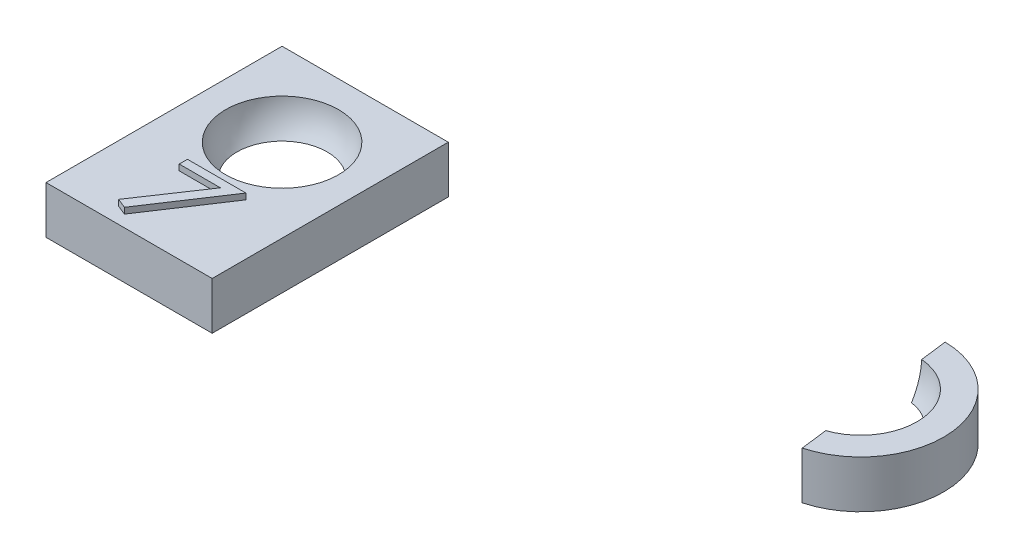
ISO-10303-21;
HEADER;
FILE_DESCRIPTION(('STEP AP214'),'2;1');
FILE_NAME('part.step','',(''),(''),'','','');
FILE_SCHEMA(('AUTOMOTIVE_DESIGN { 1 0 10303 214 1 1 1 1 }'));
ENDSEC;
DATA;
#1=APPLICATION_CONTEXT('core data for automotive mechanical design processes');
#2=APPLICATION_PROTOCOL_DEFINITION('international standard','automotive_design',2000,#1);
#3=PRODUCT_CONTEXT('',#1,'mechanical');
#4=PRODUCT('Part','Part','',(#3));
#5=PRODUCT_RELATED_PRODUCT_CATEGORY('part','',(#4));
#6=PRODUCT_DEFINITION_FORMATION('','',#4);
#7=PRODUCT_DEFINITION_CONTEXT('part definition',#1,'design');
#8=PRODUCT_DEFINITION('design','',#6,#7);
#9=PRODUCT_DEFINITION_SHAPE('','',#8);
#10=(LENGTH_UNIT() NAMED_UNIT(*) SI_UNIT(.MILLI.,.METRE.));
#11=(NAMED_UNIT(*) PLANE_ANGLE_UNIT() SI_UNIT($,.RADIAN.));
#12=(NAMED_UNIT(*) SI_UNIT($,.STERADIAN.) SOLID_ANGLE_UNIT());
#13=UNCERTAINTY_MEASURE_WITH_UNIT(LENGTH_MEASURE(1.E-05),#10,'distance_accuracy_value','');
#14=(GEOMETRIC_REPRESENTATION_CONTEXT(3) GLOBAL_UNCERTAINTY_ASSIGNED_CONTEXT((#13)) GLOBAL_UNIT_ASSIGNED_CONTEXT((#10,
#11,#12)) REPRESENTATION_CONTEXT('',''));
#15=CARTESIAN_POINT('',(0.,0.,0.));
#16=DIRECTION('',(0.,0.,1.));
#17=DIRECTION('',(1.,0.,0.));
#18=AXIS2_PLACEMENT_3D('',#15,#16,#17);
#19=CARTESIAN_POINT('',(0.,-15.5700000000001,1.90819582357449E-13));
#20=DIRECTION('',(0.,1.,0.));
#21=DIRECTION('',(-1.,0.,0.));
#22=AXIS2_PLACEMENT_3D('',#19,#20,#21);
#23=PLANE('',#22);
#24=CARTESIAN_POINT('',(-18.0191847198285,-15.5700000000003,-18.0208152801712));
#25=DIRECTION('',(0.,1.,0.));
#26=DIRECTION('',(0.,0.,1.));
#27=AXIS2_PLACEMENT_3D('',#24,#25,#26);
#28=CIRCLE('',#27,4.75526024524421);
#29=CARTESIAN_POINT('',(-18.0191847198285,-15.5700000000003,-22.7760755254154));
#30=VERTEX_POINT('',#29);
#31=EDGE_CURVE('E150',#30,#30,#28,.T.);
#32=ORIENTED_EDGE('',*,*,#31,.F.);
#33=EDGE_LOOP('',(#32));
#34=FACE_BOUND('',#33,.T.);
#35=DIRECTION('',(-0.928008798646951,0.,-0.372558276829067));
#36=VECTOR('',#35,1.);
#37=CARTESIAN_POINT('',(-19.4090428366668,-15.5700000000002,-6.13292969030034));
#38=LINE('',#37,#36);
#39=CARTESIAN_POINT('',(-19.4090428366668,-15.5700000000002,-6.13292969030034));
#40=VERTEX_POINT('',#39);
#41=CARTESIAN_POINT('',(-20.2323601443591,-15.5700000000002,-6.46345853645418));
#42=VERTEX_POINT('',#41);
#43=EDGE_CURVE('E194',#40,#42,#38,.T.);
#44=ORIENTED_EDGE('',*,*,#43,.T.);
#45=DIRECTION('',(0.557658175998312,0.,-0.830070695026776));
#46=VECTOR('',#45,1.);
#47=CARTESIAN_POINT('',(-20.2323601443591,-15.5700000000002,-6.46345853645418));
#48=LINE('',#47,#46);
#49=CARTESIAN_POINT('',(-16.7852447597437,-15.5700000000002,-11.5944681518388));
#50=VERTEX_POINT('',#49);
#51=EDGE_CURVE('E197',#42,#50,#48,.T.);
#52=ORIENTED_EDGE('',*,*,#51,.T.);
#53=DIRECTION('',(-1.,0.,0.));
#54=VECTOR('',#53,1.);
#55=CARTESIAN_POINT('',(-16.7852447597437,-15.5700000000002,-11.5944681518388));
#56=LINE('',#55,#54);
#57=CARTESIAN_POINT('',(-20.2563986058976,-15.5700000000002,-11.5944681518388));
#58=VERTEX_POINT('',#57);
#59=EDGE_CURVE('E172',#50,#58,#56,.T.);
#60=ORIENTED_EDGE('',*,*,#59,.T.);
#61=DIRECTION('',(0.,0.,-1.));
#62=VECTOR('',#61,1.);
#63=CARTESIAN_POINT('',(-20.2563986058976,-15.5700000000002,-11.5944681518388));
#64=LINE('',#63,#62);
#65=CARTESIAN_POINT('',(-20.2563986058976,-15.5700000000002,-12.2867758441465));
#66=VERTEX_POINT('',#65);
#67=EDGE_CURVE('E80',#58,#66,#64,.T.);
#68=ORIENTED_EDGE('',*,*,#67,.T.);
#69=DIRECTION('',(1.,0.,0.));
#70=VECTOR('',#69,1.);
#71=CARTESIAN_POINT('',(-20.2563986058976,-15.5700000000002,-12.2867758441465));
#72=LINE('',#71,#70);
#73=CARTESIAN_POINT('',(-15.3333216828206,-15.5700000000002,-12.2867758441465));
#74=VERTEX_POINT('',#73);
#75=EDGE_CURVE('E189',#66,#74,#72,.T.);
#76=ORIENTED_EDGE('',*,*,#75,.T.);
#77=DIRECTION('',(-0.552179947683433,0.,0.833724957870592));
#78=VECTOR('',#77,1.);
#79=CARTESIAN_POINT('',(-15.3333216828206,-15.5700000000002,-12.2867758441465));
#80=LINE('',#79,#78);
#81=EDGE_CURVE('E192',#74,#40,#80,.T.);
#82=ORIENTED_EDGE('',*,*,#81,.T.);
#83=EDGE_LOOP('',(#44,#52,#60,#68,#76,#82));
#84=FACE_BOUND('',#83,.T.);
#85=DIRECTION('',(1.,0.,0.));
#86=VECTOR('',#85,1.);
#87=CARTESIAN_POINT('',(0.,-15.5700000000001,-5.13292969030034));
#88=LINE('',#87,#86);
#89=CARTESIAN_POINT('',(-25.0191847198285,-15.5700000000002,-5.13292969030033));
#90=VERTEX_POINT('',#89);
#91=CARTESIAN_POINT('',(-11.0191847198285,-15.5700000000002,-5.13292969030034));
#92=VERTEX_POINT('',#91);
#93=EDGE_CURVE('E72',#90,#92,#88,.T.);
#94=ORIENTED_EDGE('',*,*,#93,.T.);
#95=DIRECTION('',(0.,0.,-1.));
#96=VECTOR('',#95,1.);
#97=CARTESIAN_POINT('',(-11.0191847198285,-15.5700000000002,1.91780732215901E-13));
#98=LINE('',#97,#96);
#99=CARTESIAN_POINT('',(-11.0191847198285,-15.5700000000002,-25.0208152801712));
#100=VERTEX_POINT('',#99);
#101=EDGE_CURVE('E163',#92,#100,#98,.T.);
#102=ORIENTED_EDGE('',*,*,#101,.T.);
#103=DIRECTION('',(-1.,0.,0.));
#104=VECTOR('',#103,1.);
#105=CARTESIAN_POINT('',(-5.99999999999993,-15.5700000000002,-25.0208152801712));
#106=LINE('',#105,#104);
#107=CARTESIAN_POINT('',(-25.0191847198285,-15.5700000000003,-25.0208152801712));
#108=VERTEX_POINT('',#107);
#109=EDGE_CURVE('E165',#100,#108,#106,.T.);
#110=ORIENTED_EDGE('',*,*,#109,.T.);
#111=DIRECTION('',(0.,0.,1.));
#112=VECTOR('',#111,1.);
#113=CARTESIAN_POINT('',(-25.0191847198285,-15.5700000000002,0.));
#114=LINE('',#113,#112);
#115=EDGE_CURVE('E159',#108,#90,#114,.T.);
#116=ORIENTED_EDGE('',*,*,#115,.T.);
#117=EDGE_LOOP('',(#94,#102,#110,#116));
#118=FACE_BOUND('',#117,.T.);
#119=ADVANCED_FACE('F56',(#34,#84,#118),#23,.T.);
#120=CARTESIAN_POINT('',(0.,-19.5700000000001,2.04697370165263E-13));
#121=DIRECTION('',(0.,1.,0.));
#122=DIRECTION('',(-1.,0.,0.));
#123=AXIS2_PLACEMENT_3D('',#120,#121,#122);
#124=PLANE('',#123);
#125=CARTESIAN_POINT('',(-18.0191847198285,-19.5700000000003,-18.0208152801712));
#126=DIRECTION('',(0.,1.,0.));
#127=DIRECTION('',(0.,0.,1.));
#128=AXIS2_PLACEMENT_3D('',#125,#126,#127);
#129=CIRCLE('',#128,6.20608891324561);
#130=CARTESIAN_POINT('',(-18.0191847198285,-19.5700000000002,-11.8147263669256));
#131=VERTEX_POINT('',#130);
#132=EDGE_CURVE('E65',#131,#131,#129,.T.);
#133=ORIENTED_EDGE('',*,*,#132,.T.);
#134=EDGE_LOOP('',(#133));
#135=FACE_BOUND('',#134,.T.);
#136=DIRECTION('',(0.,0.,-1.));
#137=VECTOR('',#136,1.);
#138=CARTESIAN_POINT('',(-11.0191847198285,-19.5700000000009,-25.0208152801712));
#139=LINE('',#138,#137);
#140=CARTESIAN_POINT('',(-11.0191847198285,-19.5700000000008,-5.13292969030032));
#141=VERTEX_POINT('',#140);
#142=CARTESIAN_POINT('',(-11.0191847198285,-19.5700000000009,-25.0208152801712));
#143=VERTEX_POINT('',#142);
#144=EDGE_CURVE('E143',#141,#143,#139,.T.);
#145=ORIENTED_EDGE('',*,*,#144,.F.);
#146=DIRECTION('',(1.,0.,0.));
#147=VECTOR('',#146,1.);
#148=CARTESIAN_POINT('',(-25.0191847198285,-19.5700000000009,-5.13292969030032));
#149=LINE('',#148,#147);
#150=CARTESIAN_POINT('',(-25.0191847198285,-19.5700000000009,-5.13292969030032));
#151=VERTEX_POINT('',#150);
#152=EDGE_CURVE('E136',#151,#141,#149,.T.);
#153=ORIENTED_EDGE('',*,*,#152,.F.);
#154=DIRECTION('',(0.,0.,-1.));
#155=VECTOR('',#154,1.);
#156=CARTESIAN_POINT('',(-25.0191847198285,-19.5700000000002,0.));
#157=LINE('',#156,#155);
#158=CARTESIAN_POINT('',(-25.0191847198285,-19.5700000000003,-25.0208152801712));
#159=VERTEX_POINT('',#158);
#160=EDGE_CURVE('E148',#151,#159,#157,.T.);
#161=ORIENTED_EDGE('',*,*,#160,.T.);
#162=DIRECTION('',(1.,0.,0.));
#163=VECTOR('',#162,1.);
#164=CARTESIAN_POINT('',(-5.99999999999992,-19.5700000000002,-25.0208152801712));
#165=LINE('',#164,#163);
#166=EDGE_CURVE('E156',#159,#143,#165,.T.);
#167=ORIENTED_EDGE('',*,*,#166,.T.);
#168=EDGE_LOOP('',(#145,#153,#161,#167));
#169=FACE_BOUND('',#168,.T.);
#170=ADVANCED_FACE('F146',(#135,#169),#124,.F.);
#171=CARTESIAN_POINT('',(-5.99999999999981,-50.9988177425023,-25.0208152801711));
#172=DIRECTION('',(0.,0.,-1.));
#173=DIRECTION('',(0.,1.,0.));
#174=AXIS2_PLACEMENT_3D('',#171,#172,#173);
#175=PLANE('',#174);
#176=ORIENTED_EDGE('',*,*,#109,.F.);
#177=DIRECTION('',(0.,1.,0.));
#178=VECTOR('',#177,1.);
#179=CARTESIAN_POINT('',(-11.0191847198285,-19.5700000000009,-25.0208152801712));
#180=LINE('',#179,#178);
#181=EDGE_CURVE('E278',#143,#100,#180,.T.);
#182=ORIENTED_EDGE('',*,*,#181,.F.);
#183=ORIENTED_EDGE('',*,*,#166,.F.);
#184=DIRECTION('',(0.,1.,0.));
#185=VECTOR('',#184,1.);
#186=CARTESIAN_POINT('',(-25.0191847198284,-50.9988177425024,-25.0208152801711));
#187=LINE('',#186,#185);
#188=EDGE_CURVE('E155',#159,#108,#187,.T.);
#189=ORIENTED_EDGE('',*,*,#188,.T.);
#190=EDGE_LOOP('',(#176,#182,#183,#189));
#191=FACE_BOUND('',#190,.T.);
#192=ADVANCED_FACE('F233',(#191),#175,.T.);
#193=CARTESIAN_POINT('',(-25.0191847198284,-50.9988177425023,1.80390598819962E-13));
#194=DIRECTION('',(-1.,0.,0.));
#195=DIRECTION('',(0.,-1.,0.));
#196=AXIS2_PLACEMENT_3D('',#193,#194,#195);
#197=PLANE('',#196);
#198=ORIENTED_EDGE('',*,*,#160,.F.);
#199=DIRECTION('',(0.,1.,0.));
#200=VECTOR('',#199,1.);
#201=CARTESIAN_POINT('',(-25.0191847198285,-19.5700000000009,-5.13292969030032));
#202=LINE('',#201,#200);
#203=EDGE_CURVE('E133',#151,#90,#202,.T.);
#204=ORIENTED_EDGE('',*,*,#203,.T.);
#205=ORIENTED_EDGE('',*,*,#115,.F.);
#206=ORIENTED_EDGE('',*,*,#188,.F.);
#207=EDGE_LOOP('',(#198,#204,#205,#206));
#208=FACE_BOUND('',#207,.T.);
#209=ADVANCED_FACE('F153',(#208),#197,.T.);
#210=CARTESIAN_POINT('',(-20.2563986058976,-15.0700000000002,-11.5944681518388));
#211=DIRECTION('',(-1.,0.,0.));
#212=DIRECTION('',(0.,-1.,0.));
#213=AXIS2_PLACEMENT_3D('',#210,#211,#212);
#214=PLANE('',#213);
#215=ORIENTED_EDGE('',*,*,#67,.F.);
#216=DIRECTION('',(0.,-1.,0.));
#217=VECTOR('',#216,1.);
#218=CARTESIAN_POINT('',(-20.2563986058976,-15.0700000000002,-11.5944681518388));
#219=LINE('',#218,#217);
#220=CARTESIAN_POINT('',(-20.2563986058976,-15.0700000000002,-11.5944681518388));
#221=VERTEX_POINT('',#220);
#222=EDGE_CURVE('E200',#221,#58,#219,.T.);
#223=ORIENTED_EDGE('',*,*,#222,.F.);
#224=DIRECTION('',(0.,0.,-1.));
#225=VECTOR('',#224,1.);
#226=CARTESIAN_POINT('',(-20.2563986058976,-15.0700000000002,-11.5944681518388));
#227=LINE('',#226,#225);
#228=CARTESIAN_POINT('',(-20.2563986058976,-15.0700000000002,-12.2867758441465));
#229=VERTEX_POINT('',#228);
#230=EDGE_CURVE('E168',#221,#229,#227,.T.);
#231=ORIENTED_EDGE('',*,*,#230,.T.);
#232=DIRECTION('',(0.,-1.,0.));
#233=VECTOR('',#232,1.);
#234=CARTESIAN_POINT('',(-20.2563986058976,-15.0700000000002,-12.2867758441465));
#235=LINE('',#234,#233);
#236=EDGE_CURVE('E187',#229,#66,#235,.T.);
#237=ORIENTED_EDGE('',*,*,#236,.T.);
#238=EDGE_LOOP('',(#215,#223,#231,#237));
#239=FACE_BOUND('',#238,.T.);
#240=ADVANCED_FACE('F238',(#239),#214,.T.);
#241=CARTESIAN_POINT('',(-16.7852447597437,-15.0700000000002,-11.5944681518388));
#242=DIRECTION('',(0.,0.,1.));
#243=DIRECTION('',(0.,-1.,0.));
#244=AXIS2_PLACEMENT_3D('',#241,#242,#243);
#245=PLANE('',#244);
#246=ORIENTED_EDGE('',*,*,#59,.F.);
#247=DIRECTION('',(0.,-1.,0.));
#248=VECTOR('',#247,1.);
#249=CARTESIAN_POINT('',(-16.7852447597437,-15.0700000000002,-11.5944681518388));
#250=LINE('',#249,#248);
#251=CARTESIAN_POINT('',(-16.7852447597437,-15.0700000000002,-11.5944681518388));
#252=VERTEX_POINT('',#251);
#253=EDGE_CURVE('E204',#252,#50,#250,.T.);
#254=ORIENTED_EDGE('',*,*,#253,.F.);
#255=DIRECTION('',(-1.,0.,0.));
#256=VECTOR('',#255,1.);
#257=CARTESIAN_POINT('',(-16.7852447597437,-15.0700000000002,-11.5944681518388));
#258=LINE('',#257,#256);
#259=EDGE_CURVE('E184',#252,#221,#258,.T.);
#260=ORIENTED_EDGE('',*,*,#259,.T.);
#261=ORIENTED_EDGE('',*,*,#222,.T.);
#262=EDGE_LOOP('',(#246,#254,#260,#261));
#263=FACE_BOUND('',#262,.T.);
#264=ADVANCED_FACE('F241',(#263),#245,.T.);
#265=CARTESIAN_POINT('',(-20.2323601443591,-15.0700000000002,-6.46345853645418));
#266=DIRECTION('',(-0.830070695026776,0.,-0.557658175998312));
#267=DIRECTION('',(-0.557658175998312,0.,0.830070695026776));
#268=AXIS2_PLACEMENT_3D('',#265,#266,#267);
#269=PLANE('',#268);
#270=ORIENTED_EDGE('',*,*,#51,.F.);
#271=DIRECTION('',(0.,-1.,0.));
#272=VECTOR('',#271,1.);
#273=CARTESIAN_POINT('',(-20.2323601443591,-15.0700000000002,-6.46345853645418));
#274=LINE('',#273,#272);
#275=CARTESIAN_POINT('',(-20.2323601443591,-15.0700000000002,-6.46345853645418));
#276=VERTEX_POINT('',#275);
#277=EDGE_CURVE('E206',#276,#42,#274,.T.);
#278=ORIENTED_EDGE('',*,*,#277,.F.);
#279=DIRECTION('',(0.557658175998312,0.,-0.830070695026776));
#280=VECTOR('',#279,1.);
#281=CARTESIAN_POINT('',(-20.2323601443591,-15.0700000000002,-6.46345853645418));
#282=LINE('',#281,#280);
#283=EDGE_CURVE('E181',#276,#252,#282,.T.);
#284=ORIENTED_EDGE('',*,*,#283,.T.);
#285=ORIENTED_EDGE('',*,*,#253,.T.);
#286=EDGE_LOOP('',(#270,#278,#284,#285));
#287=FACE_BOUND('',#286,.T.);
#288=ADVANCED_FACE('F254',(#287),#269,.T.);
#289=CARTESIAN_POINT('',(-19.4090428366668,-15.0700000000002,-6.13292969030034));
#290=DIRECTION('',(-0.372558276829067,0.,0.928008798646951));
#291=DIRECTION('',(0.928008798646951,0.,0.372558276829067));
#292=AXIS2_PLACEMENT_3D('',#289,#290,#291);
#293=PLANE('',#292);
#294=ORIENTED_EDGE('',*,*,#43,.F.);
#295=DIRECTION('',(0.,-1.,0.));
#296=VECTOR('',#295,1.);
#297=CARTESIAN_POINT('',(-19.4090428366668,-15.0700000000002,-6.13292969030034));
#298=LINE('',#297,#296);
#299=CARTESIAN_POINT('',(-19.4090428366668,-15.0700000000002,-6.13292969030034));
#300=VERTEX_POINT('',#299);
#301=EDGE_CURVE('E209',#300,#40,#298,.T.);
#302=ORIENTED_EDGE('',*,*,#301,.F.);
#303=DIRECTION('',(-0.928008798646951,0.,-0.372558276829067));
#304=VECTOR('',#303,1.);
#305=CARTESIAN_POINT('',(-19.4090428366668,-15.0700000000002,-6.13292969030034));
#306=LINE('',#305,#304);
#307=EDGE_CURVE('E178',#300,#276,#306,.T.);
#308=ORIENTED_EDGE('',*,*,#307,.T.);
#309=ORIENTED_EDGE('',*,*,#277,.T.);
#310=EDGE_LOOP('',(#294,#302,#308,#309));
#311=FACE_BOUND('',#310,.T.);
#312=ADVANCED_FACE('F250',(#311),#293,.T.);
#313=CARTESIAN_POINT('',(-15.3333216828206,-15.0700000000002,-12.2867758441465));
#314=DIRECTION('',(0.833724957870592,0.,0.552179947683434));
#315=DIRECTION('',(0.552179947683433,0.,-0.833724957870592));
#316=AXIS2_PLACEMENT_3D('',#313,#314,#315);
#317=PLANE('',#316);
#318=ORIENTED_EDGE('',*,*,#81,.F.);
#319=DIRECTION('',(0.,-1.,0.));
#320=VECTOR('',#319,1.);
#321=CARTESIAN_POINT('',(-15.3333216828206,-15.0700000000002,-12.2867758441465));
#322=LINE('',#321,#320);
#323=CARTESIAN_POINT('',(-15.3333216828206,-15.0700000000002,-12.2867758441465));
#324=VERTEX_POINT('',#323);
#325=EDGE_CURVE('E212',#324,#74,#322,.T.);
#326=ORIENTED_EDGE('',*,*,#325,.F.);
#327=DIRECTION('',(-0.552179947683433,0.,0.833724957870592));
#328=VECTOR('',#327,1.);
#329=CARTESIAN_POINT('',(-15.3333216828206,-15.0700000000002,-12.2867758441465));
#330=LINE('',#329,#328);
#331=EDGE_CURVE('E175',#324,#300,#330,.T.);
#332=ORIENTED_EDGE('',*,*,#331,.T.);
#333=ORIENTED_EDGE('',*,*,#301,.T.);
#334=EDGE_LOOP('',(#318,#326,#332,#333));
#335=FACE_BOUND('',#334,.T.);
#336=ADVANCED_FACE('F246',(#335),#317,.T.);
#337=CARTESIAN_POINT('',(-20.2563986058976,-15.0700000000002,-12.2867758441465));
#338=DIRECTION('',(0.,0.,-1.));
#339=DIRECTION('',(0.,1.,0.));
#340=AXIS2_PLACEMENT_3D('',#337,#338,#339);
#341=PLANE('',#340);
#342=ORIENTED_EDGE('',*,*,#75,.F.);
#343=ORIENTED_EDGE('',*,*,#236,.F.);
#344=DIRECTION('',(1.,0.,0.));
#345=VECTOR('',#344,1.);
#346=CARTESIAN_POINT('',(-20.2563986058976,-15.0700000000002,-12.2867758441465));
#347=LINE('',#346,#345);
#348=EDGE_CURVE('E171',#229,#324,#347,.T.);
#349=ORIENTED_EDGE('',*,*,#348,.T.);
#350=ORIENTED_EDGE('',*,*,#325,.T.);
#351=EDGE_LOOP('',(#342,#343,#349,#350));
#352=FACE_BOUND('',#351,.T.);
#353=ADVANCED_FACE('F242',(#352),#341,.T.);
#354=CARTESIAN_POINT('',(0.,-15.0700000000001,0.));
#355=DIRECTION('',(0.,-1.,0.));
#356=DIRECTION('',(1.,0.,0.));
#357=AXIS2_PLACEMENT_3D('',#354,#355,#356);
#358=PLANE('',#357);
#359=ORIENTED_EDGE('',*,*,#230,.F.);
#360=ORIENTED_EDGE('',*,*,#259,.F.);
#361=ORIENTED_EDGE('',*,*,#283,.F.);
#362=ORIENTED_EDGE('',*,*,#307,.F.);
#363=ORIENTED_EDGE('',*,*,#331,.F.);
#364=ORIENTED_EDGE('',*,*,#348,.F.);
#365=EDGE_LOOP('',(#359,#360,#361,#362,#363,#364));
#366=FACE_BOUND('',#365,.T.);
#367=ADVANCED_FACE('F245',(#366),#358,.F.);
#368=CARTESIAN_POINT('',(-11.0191847198285,-19.5700000000009,-25.0208152801712));
#369=DIRECTION('',(1.,0.,0.));
#370=DIRECTION('',(0.,1.,0.));
#371=AXIS2_PLACEMENT_3D('',#368,#369,#370);
#372=PLANE('',#371);
#373=DIRECTION('',(0.,1.,0.));
#374=VECTOR('',#373,1.);
#375=CARTESIAN_POINT('',(-11.0191847198285,-19.5700000000008,-5.13292969030032));
#376=LINE('',#375,#374);
#377=EDGE_CURVE('E142',#141,#92,#376,.T.);
#378=ORIENTED_EDGE('',*,*,#377,.F.);
#379=ORIENTED_EDGE('',*,*,#144,.T.);
#380=ORIENTED_EDGE('',*,*,#181,.T.);
#381=ORIENTED_EDGE('',*,*,#101,.F.);
#382=EDGE_LOOP('',(#378,#379,#380,#381));
#383=FACE_BOUND('',#382,.T.);
#384=ADVANCED_FACE('F264',(#383),#372,.T.);
#385=CARTESIAN_POINT('',(-25.0191847198285,-19.5700000000009,-5.13292969030032));
#386=DIRECTION('',(0.,0.,1.));
#387=DIRECTION('',(0.,-1.,0.));
#388=AXIS2_PLACEMENT_3D('',#385,#386,#387);
#389=PLANE('',#388);
#390=ORIENTED_EDGE('',*,*,#203,.F.);
#391=ORIENTED_EDGE('',*,*,#152,.T.);
#392=ORIENTED_EDGE('',*,*,#377,.T.);
#393=ORIENTED_EDGE('',*,*,#93,.F.);
#394=EDGE_LOOP('',(#390,#391,#392,#393));
#395=FACE_BOUND('',#394,.T.);
#396=ADVANCED_FACE('F135',(#395),#389,.T.);
#397=CARTESIAN_POINT('',(-18.0191847198285,-15.3075000000003,-18.0208152801712));
#398=DIRECTION('',(0.,1.,0.));
#399=DIRECTION('',(0.,0.,-1.));
#400=AXIS2_PLACEMENT_3D('',#397,#398,#399);
#401=SPHERICAL_SURFACE('',#400,4.7625);
#402=CARTESIAN_POINT('',(-18.0191847198285,-18.1800664868789,-18.0208152801712));
#403=DIRECTION('',(0.,-1.,0.));
#404=DIRECTION('',(0.,0.,-1.));
#405=AXIS2_PLACEMENT_3D('',#402,#403,#404);
#406=CIRCLE('',#405,3.79865344937671);
#407=CARTESIAN_POINT('',(-18.0191847198285,-18.1800664868789,-21.8194687295479));
#408=VERTEX_POINT('',#407);
#409=EDGE_CURVE('E13',#408,#408,#406,.T.);
#410=CARTESIAN_POINT('',(-18.0191847198285,-18.1800664868789,-21.8194687295479));
#411=CARTESIAN_POINT('',(-18.0191847198285,-18.1566289967111,-21.8371923542528));
#412=CARTESIAN_POINT('',(-18.0191847198285,-18.133027437142,-21.8546990134291));
#413=CARTESIAN_POINT('',(-18.0191847198285,-18.0855043516693,-21.8892725216941));
#414=CARTESIAN_POINT('',(-18.0191847198285,-18.0615828257659,-21.9063393707828));
#415=CARTESIAN_POINT('',(-18.0191847198285,-18.0134279800933,-21.9400273798422));
#416=CARTESIAN_POINT('',(-18.0191847198285,-17.9891946603241,-21.9566485398128));
#417=CARTESIAN_POINT('',(-18.0191847198285,-17.9404245355837,-21.9894394846757));
#418=CARTESIAN_POINT('',(-18.0191847198285,-17.9158877306125,-22.0056092695679));
#419=CARTESIAN_POINT('',(-18.0191847198285,-17.866519040237,-22.0374919221387));
#420=CARTESIAN_POINT('',(-18.0191847198285,-17.8416871548327,-22.0532047898172));
#421=CARTESIAN_POINT('',(-18.0191847198285,-17.7917368115647,-22.0841682252661));
#422=CARTESIAN_POINT('',(-18.0191847198285,-17.7666183537009,-22.0994187930364));
#423=CARTESIAN_POINT('',(-18.0191847198285,-17.7161034711039,-22.1294524035841));
#424=CARTESIAN_POINT('',(-18.0191847198285,-17.6907070463706,-22.1442354463614));
#425=CARTESIAN_POINT('',(-18.0191847198285,-17.6396449310085,-22.1733289422225));
#426=CARTESIAN_POINT('',(-18.0191847198285,-17.6139792403797,-22.1876393953064));
#427=CARTESIAN_POINT('',(-18.0191847198285,-17.5623873864119,-22.2157828089361));
#428=CARTESIAN_POINT('',(-18.0191847198285,-17.5364612230729,-22.2296157694819));
#429=CARTESIAN_POINT('',(-18.0191847198285,-17.4843573061204,-22.2567994587973));
#430=CARTESIAN_POINT('',(-18.0191847198285,-17.4581795525067,-22.2701501875669));
#431=CARTESIAN_POINT('',(-18.0191847198285,-17.4055814236334,-22.2963648393025));
#432=CARTESIAN_POINT('',(-18.0191847198285,-17.3791610483738,-22.3092287622685));
#433=CARTESIAN_POINT('',(-18.0191847198285,-17.3260867279613,-22.3344653951528));
#434=CARTESIAN_POINT('',(-18.0191847198285,-17.2994327828084,-22.3468381050712));
#435=CARTESIAN_POINT('',(-18.0191847198285,-17.2459004543843,-22.3710880729079));
#436=CARTESIAN_POINT('',(-18.0191847198285,-17.2190220711131,-22.3829653308263));
#437=CARTESIAN_POINT('',(-18.0191847198285,-17.1650500751207,-22.4062203254551));
#438=CARTESIAN_POINT('',(-18.0191847198285,-17.1379564623995,-22.4175980621656));
#439=CARTESIAN_POINT('',(-18.0191847198285,-17.0835632899145,-22.4398501163091));
#440=CARTESIAN_POINT('',(-18.0191847198285,-17.0562637301507,-22.4507244337422));
#441=CARTESIAN_POINT('',(-18.0191847198285,-17.0014680165459,-22.4719659237354));
#442=CARTESIAN_POINT('',(-18.0191847198285,-16.9739718627049,-22.4823330962956));
#443=CARTESIAN_POINT('',(-18.0191847198285,-16.9187923812658,-22.5025567446978));
#444=CARTESIAN_POINT('',(-18.0191847198285,-16.8911090536676,-22.5124132205399));
#445=CARTESIAN_POINT('',(-18.0191847198285,-16.8355647091603,-22.5316120986281));
#446=CARTESIAN_POINT('',(-18.0191847198285,-16.8077036922512,-22.5409545008743));
#447=CARTESIAN_POINT('',(-18.0191847198285,-16.7518135144459,-22.5591220310168));
#448=CARTESIAN_POINT('',(-18.0191847198285,-16.7237843535497,-22.5679471589133));
#449=CARTESIAN_POINT('',(-18.0191847198285,-16.6675674907007,-22.5850771168236));
#450=CARTESIAN_POINT('',(-18.0191847198285,-16.639379788748,-22.5933819468374));
#451=CARTESIAN_POINT('',(-18.0191847198285,-16.5828555010336,-22.6094684637062));
#452=CARTESIAN_POINT('',(-18.0191847198285,-16.5545189152719,-22.6172501505611));
#453=CARTESIAN_POINT('',(-18.0191847198285,-16.4977065681956,-22.6322877150673));
#454=CARTESIAN_POINT('',(-18.0191847198285,-16.4692308068811,-22.6395435927185));
#455=CARTESIAN_POINT('',(-18.0191847198285,-16.4121498646371,-22.6535270529171));
#456=CARTESIAN_POINT('',(-18.0191847198285,-16.3835446837077,-22.6602546354645));
#457=CARTESIAN_POINT('',(-18.0191847198285,-16.3262147025122,-22.6731792005529));
#458=CARTESIAN_POINT('',(-18.0191847198285,-16.2974899022461,-22.679376183094));
#459=CARTESIAN_POINT('',(-18.0191847198285,-16.2399305236371,-22.6912374250488));
#460=CARTESIAN_POINT('',(-18.0191847198285,-16.2110959452942,-22.6969016844625));
#461=CARTESIAN_POINT('',(-18.0191847198285,-16.1533268894034,-22.7076955395736));
#462=CARTESIAN_POINT('',(-18.0191847198285,-16.1243924118555,-22.7128251352708));
#463=CARTESIAN_POINT('',(-18.0191847198285,-16.0664334706472,-22.7225479054696));
#464=CARTESIAN_POINT('',(-18.0191847198285,-16.0374090069869,-22.7271410799711));
#465=CARTESIAN_POINT('',(-18.0191847198285,-15.9792800374952,-22.7357894343362));
#466=CARTESIAN_POINT('',(-18.0191847198285,-15.9501755316638,-22.7398446141998));
#467=CARTESIAN_POINT('',(-18.0191847198285,-15.8918964491233,-22.7474155892086));
#468=CARTESIAN_POINT('',(-18.0191847198285,-15.8627218724143,-22.7509313843539));
#469=CARTESIAN_POINT('',(-18.0191847198285,-15.8043126436825,-22.7574223882167));
#470=CARTESIAN_POINT('',(-18.0191847198285,-15.7750779916597,-22.7603975969343));
#471=CARTESIAN_POINT('',(-18.0191847198285,-15.7165586274619,-22.7658063980975));
#472=CARTESIAN_POINT('',(-18.0191847198285,-15.6872739152869,-22.7682399905432));
#473=CARTESIAN_POINT('',(-18.0191847198285,-15.6286644667712,-22.772564764673));
#474=CARTESIAN_POINT('',(-18.0191847198285,-15.5993397304305,-22.7744559463571));
#475=CARTESIAN_POINT('',(-18.0191847198285,-15.5700000000003,-22.7760755254154));
#476=B_SPLINE_CURVE_WITH_KNOTS('',3,(#410,#411,#412,#413,#414,#415,#416,#417,#418,#419,#420,
#421,#422,#423,#424,#425,#426,#427,#428,#429,#430,#431,#432,#433,#434,#435,#436,#437,#438,#439,
#440,#441,#442,#443,#444,#445,#446,#447,#448,#449,#450,#451,#452,#453,#454,#455,#456,#457,#458,
#459,#460,#461,#462,#463,#464,#465,#466,#467,#468,#469,#470,#471,#472,#473,#474,#475),
.UNSPECIFIED.,.F.,.F.,(4,2,2,2,2,2,2,2,2,2,2,2,2,2,2,2,2,2,2,2,2,2,2,2,2,2,2,2,2,2,2,2,4),(0.,
0.0881519323458192,0.176303864691639,0.264455797037459,0.352607729383277,0.440759661729097,
0.528911594074916,0.617063526420733,0.705215458766552,0.793367391112372,0.881519323458191,
0.969671255804008,1.05782318814983,1.14597512049565,1.23412705284146,1.32227898518729,
1.4104309175331,1.49858284987892,1.58673478222474,1.67488671457056,1.76303864691638,
1.8511905792622,1.93934251160801,2.02749444395383,2.11564637629965,2.20379830864547,
2.29195024099129,2.38010217333711,2.46825410568293,2.55640603802875,2.64455797037457,
2.73270990272039,2.8208618350662),.UNSPECIFIED.);
#477=EDGE_CURVE('BSEAM219',#408,#30,#476,.T.);
#478=ORIENTED_EDGE('',*,*,#409,.T.);
#479=ORIENTED_EDGE('',*,*,#31,.T.);
#480=ORIENTED_EDGE('',*,*,#477,.T.);
#481=ORIENTED_EDGE('',*,*,#477,.F.);
#482=EDGE_LOOP('',(#478,#480,#479,#481));
#483=FACE_BOUND('',#482,.T.);
#484=ADVANCED_FACE('F219',(#483),#401,.F.);
#485=CARTESIAN_POINT('',(-18.0191847198285,-19.5700000000003,-18.0208152801712));
#486=DIRECTION('',(0.,-1.,0.));
#487=DIRECTION('',(0.,0.,-1.));
#488=AXIS2_PLACEMENT_3D('',#485,#486,#487);
#489=CONICAL_SURFACE('',#488,6.2060889132456,1.0471975511966);
#490=ORIENTED_EDGE('',*,*,#409,.F.);
#491=EDGE_LOOP('',(#490));
#492=FACE_BOUND('',#491,.T.);
#493=ORIENTED_EDGE('',*,*,#132,.F.);
#494=EDGE_LOOP('',(#493));
#495=FACE_BOUND('',#494,.T.);
#496=ADVANCED_FACE('F59',(#492,#495),#489,.F.);
#497=CLOSED_SHELL('',(#119,#170,#192,#209,#240,#264,#288,#312,#336,#353,#367,#384,#396,#484,#496));
#498=MANIFOLD_SOLID_BREP('B2',#497);
#499=CARTESIAN_POINT('',(24.37,-17.8200000000001,-24.3700188957371));
#500=DIRECTION('',(0.,-1.,0.));
#501=DIRECTION('',(0.,0.,-1.));
#502=AXIS2_PLACEMENT_3D('',#499,#500,#501);
#503=CONICAL_SURFACE('',#502,3.175,1.0471975511966);
#504=CARTESIAN_POINT('',(24.591680020619,-19.5707000000001,-30.5733605761064));
#505=CARTESIAN_POINT('',(24.62411249878,-19.4210633417584,-30.3127991752362));
#506=CARTESIAN_POINT('',(24.6565546461707,-19.2715623315264,-30.0521600921117));
#507=CARTESIAN_POINT('',(24.7214806848743,-18.9731102118698,-29.5305465566429));
#508=CARTESIAN_POINT('',(24.7539645791144,-18.8241591441993,-29.2695720807828));
#509=CARTESIAN_POINT('',(24.8189155716024,-18.5274556161001,-28.7477580674793));
#510=CARTESIAN_POINT('',(24.851382531109,-18.3797011658782,-28.4869196446785));
#511=CARTESIAN_POINT('',(24.9164144555035,-18.0856384492201,-27.9644554272542));
#512=CARTESIAN_POINT('',(24.9489794152463,-17.939330108532,-27.7028296739665));
#513=CARTESIAN_POINT('',(24.9980992049961,-17.7214369217852,-27.3082029925237));
#514=CARTESIAN_POINT('',(25.0145820145963,-17.648790085795,-27.1757806738103));
#515=CARTESIAN_POINT('',(25.0476227209946,-17.5045928247885,-26.9103327884485));
#516=CARTESIAN_POINT('',(25.0641806246636,-17.4330425028355,-26.7773071665991));
#517=CARTESIAN_POINT('',(25.0974455822974,-17.291492527359,-26.5100576546161));
#518=CARTESIAN_POINT('',(25.1141528875013,-17.2214967119262,-26.3758317460353));
#519=CARTESIAN_POINT('',(25.1393506613054,-17.1187226808035,-26.1733937081948));
#520=CARTESIAN_POINT('',(25.147772075631,-17.0848371141367,-26.1057363585746));
#521=CARTESIAN_POINT('',(25.1646756154505,-17.018075785263,-25.9699339079214));
#522=CARTESIAN_POINT('',(25.1731577387882,-16.9851999874104,-25.9017888242107));
#523=CARTESIAN_POINT('',(25.1905173802386,-16.9196464220005,-25.7623220689271));
#524=CARTESIAN_POINT('',(25.1993979249038,-16.8870208868123,-25.690976082137));
#525=CARTESIAN_POINT('',(25.2172742055994,-16.8239210113208,-25.5473586651364));
#526=CARTESIAN_POINT('',(25.2262699206461,-16.793446285552,-25.4750874035095));
#527=CARTESIAN_POINT('',(25.2444016068811,-16.735719848287,-25.3294180672939));
#528=CARTESIAN_POINT('',(25.2535373055015,-16.7084625976426,-25.2560221825067));
#529=CARTESIAN_POINT('',(25.2720072227694,-16.6587177585985,-25.1076355099439));
#530=CARTESIAN_POINT('',(25.2813413505776,-16.6362280372818,-25.0326454519683));
#531=CARTESIAN_POINT('',(25.2974313932516,-16.6039626059642,-24.9033786090714));
#532=CARTESIAN_POINT('',(25.3041315006663,-16.5923942430296,-24.8495501792705));
#533=CARTESIAN_POINT('',(25.3176260003785,-16.5737141891517,-24.7411358382014));
#534=CARTESIAN_POINT('',(25.3244203521638,-16.566600640437,-24.6865502524069));
#535=CARTESIAN_POINT('',(25.3380278679337,-16.5576034951404,-24.5772279442637));
#536=CARTESIAN_POINT('',(25.3448407478612,-16.5556927505757,-24.52249350402));
#537=CARTESIAN_POINT('',(25.358457117725,-16.5572526663819,-24.4131000623941));
#538=CARTESIAN_POINT('',(25.3652606066211,-16.5607238815074,-24.35844106937));
#539=CARTESIAN_POINT('',(25.3811677973013,-16.5747372334937,-24.2306432530273));
#540=CARTESIAN_POINT('',(25.3902435568996,-16.5873281945374,-24.1577289162586));
#541=CARTESIAN_POINT('',(25.4082042813606,-16.6194922004123,-24.0134330809856));
#542=CARTESIAN_POINT('',(25.417089018512,-16.6390731361799,-23.9420534119069));
#543=CARTESIAN_POINT('',(25.4347795849844,-16.6833451169797,-23.7999280165131));
#544=CARTESIAN_POINT('',(25.4435830248223,-16.7080972071069,-23.7292014872223));
#545=CARTESIAN_POINT('',(25.456667249353,-16.7477348088705,-23.6240832826836));
#546=CARTESIAN_POINT('',(25.4610077010603,-16.761362803515,-23.5892122447185));
#547=CARTESIAN_POINT('',(25.469654053496,-16.7893178421244,-23.5197477501498));
#548=CARTESIAN_POINT('',(25.4739599553034,-16.803644864159,-23.4851542848778));
#549=CARTESIAN_POINT('',(25.4880009585672,-16.8514613812364,-23.3723493532942));
#550=CARTESIAN_POINT('',(25.4976740866179,-16.8861414110069,-23.2946357791671));
#551=CARTESIAN_POINT('',(25.5169100301299,-16.9574592224695,-23.1400948784172));
#552=CARTESIAN_POINT('',(25.5264728277649,-16.99409731529,-23.0632676950106));
#553=CARTESIAN_POINT('',(25.5455215984212,-17.0687425292476,-22.9102305344701));
#554=CARTESIAN_POINT('',(25.5550075349383,-17.1067502589756,-22.8340208506096));
#555=CARTESIAN_POINT('',(25.5739193953538,-17.1837338953518,-22.6820836221787));
#556=CARTESIAN_POINT('',(25.5833453174257,-17.2227098312927,-22.6063560922828));
#557=CARTESIAN_POINT('',(25.6115809113024,-17.3407901487471,-22.3795123136974));
#558=CARTESIAN_POINT('',(25.6303233270207,-17.4209468253643,-22.2289363980678));
#559=CARTESIAN_POINT('',(25.6676962823883,-17.5828415162181,-21.9286833752521));
#560=CARTESIAN_POINT('',(25.6863268513459,-17.6645790901705,-21.7790060326051));
#561=CARTESIAN_POINT('',(25.7234241777646,-17.8286536504827,-21.4809674031724));
#562=CARTESIAN_POINT('',(25.741891285908,-17.9109854443002,-21.3326032990185));
#563=CARTESIAN_POINT('',(25.7787805307881,-18.0763301421335,-21.0362363894262));
#564=CARTESIAN_POINT('',(25.7972026642731,-18.1593430936089,-20.8882336101116));
#565=CARTESIAN_POINT('',(25.8523958947168,-18.408964531982,-20.4448131174946));
#566=CARTESIAN_POINT('',(25.8891190218168,-18.5762679138569,-20.1497807923667));
#567=CARTESIAN_POINT('',(25.9407968197458,-18.812621913447,-19.7346031622321));
#568=CARTESIAN_POINT('',(25.9557803839024,-18.8812599992507,-19.6142257292379));
#569=CARTESIAN_POINT('',(25.9857399264277,-19.0186860080391,-19.3735318072051));
#570=CARTESIAN_POINT('',(26.0007159033682,-19.087473951451,-19.2532153296405));
#571=CARTESIAN_POINT('',(26.0306871020513,-19.2252865044134,-19.0124277624414));
#572=CARTESIAN_POINT('',(26.0456823095449,-19.2943113169667,-18.8919567872825));
#573=CARTESIAN_POINT('',(26.0756638950834,-19.4324448098011,-18.6510857724483));
#574=CARTESIAN_POINT('',(26.090650274106,-19.5015534761726,-18.5306857249184));
#575=CARTESIAN_POINT('',(26.1056339867359,-19.5707000000001,-18.4103070990948));
#576=B_SPLINE_CURVE_WITH_KNOTS('',3,(#504,#505,#506,#507,#508,#509,#510,#511,#512,#513,#514,
#515,#516,#517,#518,#519,#520,#521,#522,#523,#524,#525,#526,#527,#528,#529,#530,#531,#532,#533,
#534,#535,#536,#537,#538,#539,#540,#541,#542,#543,#544,#545,#546,#547,#548,#549,#550,#551,#552,
#553,#554,#555,#556,#557,#558,#559,#560,#561,#562,#563,#564,#565,#566,#567,#568,#569,#570,#571,
#572,#573,#574,#575),.UNSPECIFIED.,.F.,.F.,(4,2,2,2,2,2,2,2,2,2,2,2,2,2,2,2,2,2,2,2,2,2,2,2,2,2,
2,2,2,2,2,2,2,2,2,4),(0.,0.906652964962353,1.81337340686129,2.7179709494366,3.62252180061956,
4.07832975442132,4.53418029080653,4.99105329218221,5.21945502192511,5.44784867960926,
5.68468406771752,5.92147690212771,6.15785594157784,6.39412900456145,6.56037400917395,
6.72654963912616,6.89185649578044,7.05718039285518,7.28034006562498,7.5037524627163,
7.72996855333241,7.8430343076348,7.95609651708402,8.21299503642838,8.46993449799463,
8.72698957220959,8.98405243300669,9.49885740240185,10.0135210049087,10.5255563967086,
11.0376277727505,12.0610718697685,12.479208026135,12.8974052750964,13.3163596911781,
13.7352521609042),.UNSPECIFIED.);
#577=CARTESIAN_POINT('',(24.5918317057548,-19.5700000000002,-30.5721419430034));
#578=VERTEX_POINT('',#577);
#579=CARTESIAN_POINT('',(24.8955421974558,-18.1800664868788,-28.1321424220391));
#580=VERTEX_POINT('',#579);
#581=EDGE_CURVE('E54',#578,#580,#576,.T.);
#582=ORIENTED_EDGE('',*,*,#581,.F.);
#583=CARTESIAN_POINT('',(24.3700000000001,-19.5700000000001,-24.3700188957371));
#584=DIRECTION('',(0.,1.,0.));
#585=DIRECTION('',(0.,0.,1.));
#586=AXIS2_PLACEMENT_3D('',#583,#584,#585);
#587=CIRCLE('',#586,6.2060889132456);
#588=CARTESIAN_POINT('',(26.1054823016001,-19.5700000000004,-18.4115257321974));
#589=VERTEX_POINT('',#588);
#590=EDGE_CURVE('E497',#589,#578,#587,.T.);
#591=ORIENTED_EDGE('',*,*,#590,.F.);
#592=CARTESIAN_POINT('',(25.8017718098991,-18.1800664868788,-20.8515252531624));
#593=VERTEX_POINT('',#592);
#594=EDGE_CURVE('E430',#593,#589,#576,.T.);
#595=ORIENTED_EDGE('',*,*,#594,.F.);
#596=CARTESIAN_POINT('',(24.37,-18.1800664868788,-24.3700188957371));
#597=DIRECTION('',(0.,-1.,0.));
#598=DIRECTION('',(0.,0.,-1.));
#599=AXIS2_PLACEMENT_3D('',#596,#597,#598);
#600=CIRCLE('',#599,3.79865344937661);
#601=EDGE_CURVE('E499',#580,#593,#600,.T.);
#602=ORIENTED_EDGE('',*,*,#601,.F.);
#603=EDGE_LOOP('',(#582,#591,#595,#602));
#604=FACE_BOUND('',#603,.T.);
#605=ADVANCED_FACE('F425',(#604),#503,.F.);
#606=CARTESIAN_POINT('',(24.37,-15.3075000000001,-24.370018895737));
#607=DIRECTION('',(0.,1.,0.));
#608=DIRECTION('',(1.,0.,0.));
#609=AXIS2_PLACEMENT_3D('',#606,#607,#608);
#610=SPHERICAL_SURFACE('',#609,4.7625);
#611=CARTESIAN_POINT('',(24.37,-15.5700000000001,-24.370018895737));
#612=DIRECTION('',(0.,1.,0.));
#613=DIRECTION('',(0.,0.,1.));
#614=AXIS2_PLACEMENT_3D('',#611,#612,#613);
#615=CIRCLE('',#614,4.75526024524421);
#616=CARTESIAN_POINT('',(25.9232483648097,-15.5700000000001,-19.8755868384893));
#617=VERTEX_POINT('',#616);
#618=CARTESIAN_POINT('',(24.7740656425453,-15.5700000000001,-29.1080808367119));
#619=VERTEX_POINT('',#618);
#620=EDGE_CURVE('E501',#617,#619,#615,.T.);
#621=ORIENTED_EDGE('',*,*,#620,.T.);
#622=CARTESIAN_POINT('',(25.3486570036775,-15.3075000000001,-24.4918338376006));
#623=DIRECTION('',(0.992342285846297,0.,-0.123518369975268));
#624=DIRECTION('',(-0.123518369975268,0.,-0.992342285846297));
#625=AXIS2_PLACEMENT_3D('',#622,#623,#624);
#626=CIRCLE('',#625,4.65927009724612);
#627=EDGE_CURVE('E493',#619,#580,#626,.F.);
#628=ORIENTED_EDGE('',*,*,#627,.T.);
#629=ORIENTED_EDGE('',*,*,#601,.T.);
#630=EDGE_CURVE('E446',#593,#617,#626,.F.);
#631=ORIENTED_EDGE('',*,*,#630,.T.);
#632=EDGE_LOOP('',(#621,#628,#629,#631));
#633=FACE_BOUND('',#632,.T.);
#634=ADVANCED_FACE('F510',(#633),#610,.F.);
#635=CARTESIAN_POINT('',(24.3700000000002,-48.5434544919826,-24.370018895737));
#636=DIRECTION('',(0.,1.,0.));
#637=DIRECTION('',(0.,0.,1.));
#638=AXIS2_PLACEMENT_3D('',#635,#636,#637);
#639=CYLINDRICAL_SURFACE('',#638,7.);
#640=DIRECTION('',(0.,1.,0.));
#641=VECTOR('',#640,1.);
#642=CARTESIAN_POINT('',(24.4926524953455,-48.5434544919826,-31.3689442679199));
#643=LINE('',#642,#641);
#644=CARTESIAN_POINT('',(24.4926524953454,-15.5700000000002,-31.36894426792));
#645=VERTEX_POINT('',#644);
#646=CARTESIAN_POINT('',(24.4926524953454,-19.5700000000005,-31.36894426792));
#647=VERTEX_POINT('',#646);
#648=EDGE_CURVE('E519',#645,#647,#643,.F.);
#649=ORIENTED_EDGE('',*,*,#648,.F.);
#650=CARTESIAN_POINT('',(24.37,-15.5700000000001,-24.3700188957371));
#651=DIRECTION('',(0.,1.,0.));
#652=DIRECTION('',(0.,0.,1.));
#653=AXIS2_PLACEMENT_3D('',#650,#651,#652);
#654=CIRCLE('',#653,7.);
#655=CARTESIAN_POINT('',(26.2046615120095,-15.5700000000001,-17.6147234072814));
#656=VERTEX_POINT('',#655);
#657=EDGE_CURVE('E492',#656,#645,#654,.T.);
#658=ORIENTED_EDGE('',*,*,#657,.F.);
#659=DIRECTION('',(0.,1.,0.));
#660=VECTOR('',#659,1.);
#661=CARTESIAN_POINT('',(26.2046615120096,-48.5434544919825,-17.6147234072812));
#662=LINE('',#661,#660);
#663=CARTESIAN_POINT('',(26.2046615120095,-19.5700000000004,-17.6147234072813));
#664=VERTEX_POINT('',#663);
#665=EDGE_CURVE('E478',#664,#656,#662,.T.);
#666=ORIENTED_EDGE('',*,*,#665,.F.);
#667=CARTESIAN_POINT('',(24.3700000000001,-19.5700000000001,-24.3700188957371));
#668=DIRECTION('',(0.,1.,0.));
#669=DIRECTION('',(0.,0.,1.));
#670=AXIS2_PLACEMENT_3D('',#667,#668,#669);
#671=CIRCLE('',#670,7.);
#672=EDGE_CURVE('E490',#647,#664,#671,.F.);
#673=ORIENTED_EDGE('',*,*,#672,.F.);
#674=EDGE_LOOP('',(#649,#658,#666,#673));
#675=FACE_BOUND('',#674,.T.);
#676=ADVANCED_FACE('F489',(#675),#639,.T.);
#677=CARTESIAN_POINT('',(0.,-19.5700000000001,2.04697370165263E-13));
#678=DIRECTION('',(0.,1.,0.));
#679=DIRECTION('',(-1.,0.,0.));
#680=AXIS2_PLACEMENT_3D('',#677,#678,#679);
#681=PLANE('',#680);
#682=ORIENTED_EDGE('',*,*,#672,.T.);
#683=DIRECTION('',(-0.123518369975268,0.,-0.992342285846297));
#684=VECTOR('',#683,1.);
#685=CARTESIAN_POINT('',(32.4651331686556,-19.5700000000002,32.6816880129476));
#686=LINE('',#685,#684);
#687=EDGE_CURVE('E475',#664,#589,#686,.T.);
#688=ORIENTED_EDGE('',*,*,#687,.T.);
#689=ORIENTED_EDGE('',*,*,#590,.T.);
#690=EDGE_CURVE('E453',#578,#647,#686,.T.);
#691=ORIENTED_EDGE('',*,*,#690,.T.);
#692=EDGE_LOOP('',(#682,#688,#689,#691));
#693=FACE_BOUND('',#692,.T.);
#694=ADVANCED_FACE('F496',(#693),#681,.F.);
#695=CARTESIAN_POINT('',(0.,-15.5700000000001,1.90819582357449E-13));
#696=DIRECTION('',(0.,1.,0.));
#697=DIRECTION('',(-1.,0.,0.));
#698=AXIS2_PLACEMENT_3D('',#695,#696,#697);
#699=PLANE('',#698);
#700=DIRECTION('',(-0.123518369975268,0.,-0.992342285846297));
#701=VECTOR('',#700,1.);
#702=CARTESIAN_POINT('',(27.9639432671263,-15.57,-3.48071501104119));
#703=LINE('',#702,#701);
#704=EDGE_CURVE('E494',#656,#617,#703,.T.);
#705=ORIENTED_EDGE('',*,*,#704,.F.);
#706=ORIENTED_EDGE('',*,*,#657,.T.);
#707=EDGE_CURVE('E515',#619,#645,#703,.T.);
#708=ORIENTED_EDGE('',*,*,#707,.F.);
#709=ORIENTED_EDGE('',*,*,#620,.F.);
#710=EDGE_LOOP('',(#705,#706,#708,#709));
#711=FACE_BOUND('',#710,.T.);
#712=ADVANCED_FACE('F518',(#711),#699,.T.);
#713=CARTESIAN_POINT('',(32.4651331686556,-19.5700000000002,32.6816880129476));
#714=DIRECTION('',(0.992342285846297,0.,-0.123518369975268));
#715=DIRECTION('',(-0.123518369975268,0.,-0.992342285846297));
#716=AXIS2_PLACEMENT_3D('',#713,#714,#715);
#717=PLANE('',#716);
#718=ORIENTED_EDGE('',*,*,#665,.T.);
#719=ORIENTED_EDGE('',*,*,#704,.T.);
#720=ORIENTED_EDGE('',*,*,#630,.F.);
#721=ORIENTED_EDGE('',*,*,#594,.T.);
#722=ORIENTED_EDGE('',*,*,#687,.F.);
#723=EDGE_LOOP('',(#718,#719,#720,#721,#722));
#724=FACE_BOUND('',#723,.T.);
#725=ADVANCED_FACE('F477',(#724),#717,.F.);
#726=ORIENTED_EDGE('',*,*,#648,.T.);
#727=ORIENTED_EDGE('',*,*,#690,.F.);
#728=ORIENTED_EDGE('',*,*,#581,.T.);
#729=ORIENTED_EDGE('',*,*,#627,.F.);
#730=ORIENTED_EDGE('',*,*,#707,.T.);
#731=EDGE_LOOP('',(#726,#727,#728,#729,#730));
#732=FACE_BOUND('',#731,.T.);
#733=ADVANCED_FACE('F513',(#732),#717,.F.);
#734=CLOSED_SHELL('',(#605,#634,#676,#694,#712,#725,#733));
#735=MANIFOLD_SOLID_BREP('B7',#734);
#736=ADVANCED_BREP_SHAPE_REPRESENTATION('',(#18,#498,#735),#14);
#737=SHAPE_DEFINITION_REPRESENTATION(#9,#736);
ENDSEC;
END-ISO-10303-21;
